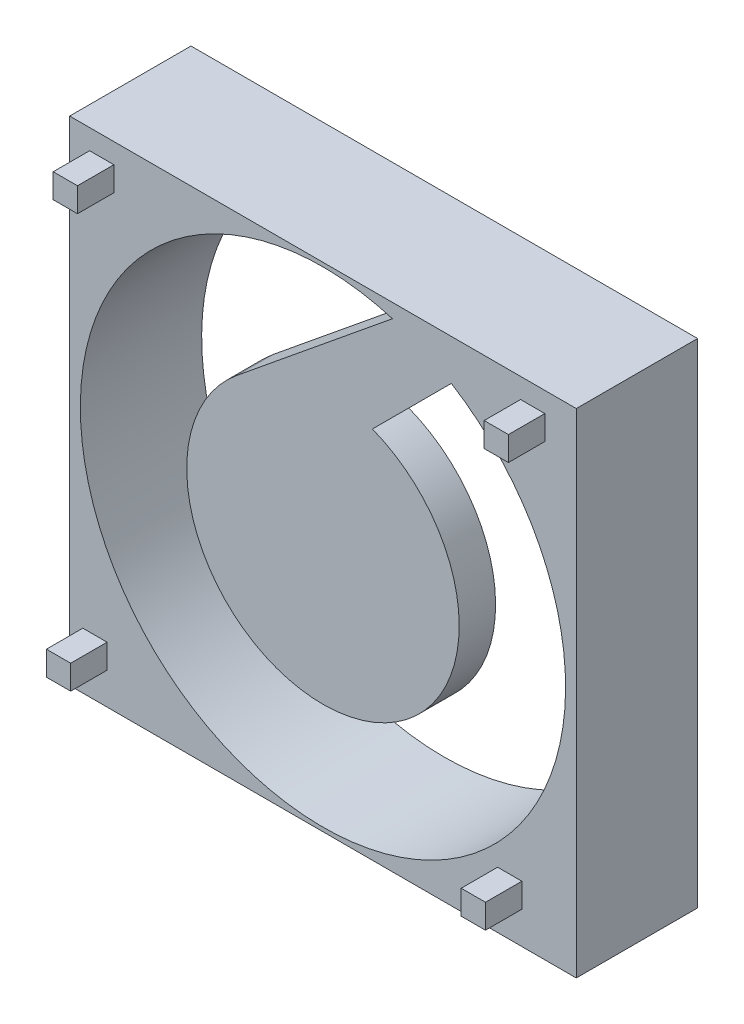
ISO-10303-21;
HEADER;
FILE_DESCRIPTION(('STEP AP214'),'2;1');
FILE_NAME('part.step','',(''),(''),'','','');
FILE_SCHEMA(('AUTOMOTIVE_DESIGN { 1 0 10303 214 1 1 1 1 }'));
ENDSEC;
DATA;
#1=APPLICATION_CONTEXT('core data for automotive mechanical design processes');
#2=APPLICATION_PROTOCOL_DEFINITION('international standard','automotive_design',2000,#1);
#3=PRODUCT_CONTEXT('',#1,'mechanical');
#4=PRODUCT('Part','Part','',(#3));
#5=PRODUCT_RELATED_PRODUCT_CATEGORY('part','',(#4));
#6=PRODUCT_DEFINITION_FORMATION('','',#4);
#7=PRODUCT_DEFINITION_CONTEXT('part definition',#1,'design');
#8=PRODUCT_DEFINITION('design','',#6,#7);
#9=PRODUCT_DEFINITION_SHAPE('','',#8);
#10=(LENGTH_UNIT() NAMED_UNIT(*) SI_UNIT(.MILLI.,.METRE.));
#11=(NAMED_UNIT(*) PLANE_ANGLE_UNIT() SI_UNIT($,.RADIAN.));
#12=(NAMED_UNIT(*) SI_UNIT($,.STERADIAN.) SOLID_ANGLE_UNIT());
#13=UNCERTAINTY_MEASURE_WITH_UNIT(LENGTH_MEASURE(1.E-05),#10,'distance_accuracy_value','');
#14=(GEOMETRIC_REPRESENTATION_CONTEXT(3) GLOBAL_UNCERTAINTY_ASSIGNED_CONTEXT((#13)) GLOBAL_UNIT_ASSIGNED_CONTEXT((#10,
#11,#12)) REPRESENTATION_CONTEXT('',''));
#15=CARTESIAN_POINT('',(0.,0.,0.));
#16=DIRECTION('',(0.,0.,1.));
#17=DIRECTION('',(1.,0.,0.));
#18=AXIS2_PLACEMENT_3D('',#15,#16,#17);
#19=CARTESIAN_POINT('',(0.,0.,10.));
#20=DIRECTION('',(0.,0.,-1.));
#21=DIRECTION('',(-1.,0.,0.));
#22=AXIS2_PLACEMENT_3D('',#19,#20,#21);
#23=PLANE('',#22);
#24=DIRECTION('',(-1.,0.,0.));
#25=VECTOR('',#24,1.);
#26=CARTESIAN_POINT('',(0.,18.6727603891518,10.));
#27=LINE('',#26,#25);
#28=CARTESIAN_POINT('',(18.287307426408,18.6727603891518,10.));
#29=VERTEX_POINT('',#28);
#30=CARTESIAN_POINT('',(16.287307426408,18.6727603891518,10.));
#31=VERTEX_POINT('',#30);
#32=EDGE_CURVE('E315',#29,#31,#27,.T.);
#33=ORIENTED_EDGE('',*,*,#32,.F.);
#34=DIRECTION('',(0.,-1.,0.));
#35=VECTOR('',#34,1.);
#36=CARTESIAN_POINT('',(18.287307426408,0.,10.));
#37=LINE('',#36,#35);
#38=CARTESIAN_POINT('',(18.287307426408,16.6727603891518,10.));
#39=VERTEX_POINT('',#38);
#40=EDGE_CURVE('E302',#29,#39,#37,.T.);
#41=ORIENTED_EDGE('',*,*,#40,.T.);
#42=DIRECTION('',(-1.,0.,0.));
#43=VECTOR('',#42,1.);
#44=CARTESIAN_POINT('',(0.,16.6727603891518,10.));
#45=LINE('',#44,#43);
#46=CARTESIAN_POINT('',(16.287307426408,16.6727603891518,10.));
#47=VERTEX_POINT('',#46);
#48=EDGE_CURVE('E306',#39,#47,#45,.T.);
#49=ORIENTED_EDGE('',*,*,#48,.T.);
#50=DIRECTION('',(0.,-1.,0.));
#51=VECTOR('',#50,1.);
#52=CARTESIAN_POINT('',(16.287307426408,0.,10.));
#53=LINE('',#52,#51);
#54=EDGE_CURVE('E311',#31,#47,#53,.T.);
#55=ORIENTED_EDGE('',*,*,#54,.F.);
#56=EDGE_LOOP('',(#33,#41,#49,#55));
#57=FACE_BOUND('',#56,.T.);
#58=CARTESIAN_POINT('',(0.,0.,10.));
#59=DIRECTION('',(0.,0.,1.));
#60=DIRECTION('',(1.,0.,0.));
#61=AXIS2_PLACEMENT_3D('',#58,#59,#60);
#62=CIRCLE('',#61,20.);
#63=CARTESIAN_POINT('',(5.72982948591692,19.1616558277806,10.));
#64=VERTEX_POINT('',#63);
#65=CARTESIAN_POINT('',(10.5825049723093,16.9708747126084,10.));
#66=VERTEX_POINT('',#65);
#67=EDGE_CURVE('E418',#64,#66,#62,.T.);
#68=ORIENTED_EDGE('',*,*,#67,.F.);
#69=DIRECTION('',(-0.775008591387662,-0.63195069687066,0.));
#70=VECTOR('',#69,1.);
#71=CARTESIAN_POINT('',(-7.09647654565236,8.70294204705537,10.));
#72=LINE('',#71,#70);
#73=CARTESIAN_POINT('',(-7.09647654565236,8.70294204705537,10.));
#74=VERTEX_POINT('',#73);
#75=EDGE_CURVE('E376',#64,#74,#72,.T.);
#76=ORIENTED_EDGE('',*,*,#75,.T.);
#77=CARTESIAN_POINT('',(0.,0.,10.));
#78=DIRECTION('',(0.,0.,1.));
#79=DIRECTION('',(1.,0.,0.));
#80=AXIS2_PLACEMENT_3D('',#77,#78,#79);
#81=CIRCLE('',#80,11.2294781551681);
#82=CARTESIAN_POINT('',(4.0754624964018,10.4638322367009,10.));
#83=VERTEX_POINT('',#82);
#84=EDGE_CURVE('E397',#74,#83,#81,.T.);
#85=ORIENTED_EDGE('',*,*,#84,.T.);
#86=DIRECTION('',(0.707106781186546,0.707106781186549,0.));
#87=VECTOR('',#86,1.);
#88=CARTESIAN_POINT('',(4.0754624964018,10.4638322367009,10.));
#89=LINE('',#88,#87);
#90=EDGE_CURVE('E381',#83,#66,#89,.T.);
#91=ORIENTED_EDGE('',*,*,#90,.T.);
#92=EDGE_LOOP('',(#68,#76,#85,#91));
#93=FACE_BOUND('',#92,.T.);
#94=DIRECTION('',(0.,1.,0.));
#95=VECTOR('',#94,1.);
#96=CARTESIAN_POINT('',(20.8800063632261,-20.3263698308678,10.));
#97=LINE('',#96,#95);
#98=CARTESIAN_POINT('',(20.8800063632261,-20.3263698308678,10.));
#99=VERTEX_POINT('',#98);
#100=CARTESIAN_POINT('',(20.8800063632261,20.3263698308678,10.));
#101=VERTEX_POINT('',#100);
#102=EDGE_CURVE('E425',#99,#101,#97,.T.);
#103=ORIENTED_EDGE('',*,*,#102,.T.);
#104=DIRECTION('',(-1.,0.,0.));
#105=VECTOR('',#104,1.);
#106=CARTESIAN_POINT('',(-20.8800063632261,20.3263698308678,10.));
#107=LINE('',#106,#105);
#108=CARTESIAN_POINT('',(-20.8800063632261,20.3263698308678,10.));
#109=VERTEX_POINT('',#108);
#110=EDGE_CURVE('E429',#101,#109,#107,.T.);
#111=ORIENTED_EDGE('',*,*,#110,.T.);
#112=DIRECTION('',(0.,-1.,0.));
#113=VECTOR('',#112,1.);
#114=CARTESIAN_POINT('',(-20.8800063632261,-20.3263698308678,10.));
#115=LINE('',#114,#113);
#116=CARTESIAN_POINT('',(-20.8800063632261,-20.3263698308678,10.));
#117=VERTEX_POINT('',#116);
#118=EDGE_CURVE('E433',#109,#117,#115,.T.);
#119=ORIENTED_EDGE('',*,*,#118,.T.);
#120=DIRECTION('',(1.,0.,0.));
#121=VECTOR('',#120,1.);
#122=CARTESIAN_POINT('',(-20.8800063632261,-20.3263698308678,10.));
#123=LINE('',#122,#121);
#124=EDGE_CURVE('E436',#117,#99,#123,.T.);
#125=ORIENTED_EDGE('',*,*,#124,.T.);
#126=EDGE_LOOP('',(#103,#111,#119,#125));
#127=FACE_BOUND('',#126,.T.);
#128=DIRECTION('',(-1.,0.,0.));
#129=VECTOR('',#128,1.);
#130=CARTESIAN_POINT('',(0.,-15.6597907370151,10.));
#131=LINE('',#130,#129);
#132=CARTESIAN_POINT('',(16.3955137929253,-15.6597907370151,10.));
#133=VERTEX_POINT('',#132);
#134=CARTESIAN_POINT('',(14.3955137929253,-15.6597907370151,10.));
#135=VERTEX_POINT('',#134);
#136=EDGE_CURVE('E319',#133,#135,#131,.T.);
#137=ORIENTED_EDGE('',*,*,#136,.F.);
#138=DIRECTION('',(0.,-1.,0.));
#139=VECTOR('',#138,1.);
#140=CARTESIAN_POINT('',(16.3955137929253,0.,10.));
#141=LINE('',#140,#139);
#142=CARTESIAN_POINT('',(16.3955137929253,-17.6597907370151,10.));
#143=VERTEX_POINT('',#142);
#144=EDGE_CURVE('E338',#133,#143,#141,.T.);
#145=ORIENTED_EDGE('',*,*,#144,.T.);
#146=DIRECTION('',(-1.,0.,0.));
#147=VECTOR('',#146,1.);
#148=CARTESIAN_POINT('',(0.,-17.6597907370151,10.));
#149=LINE('',#148,#147);
#150=CARTESIAN_POINT('',(14.3955137929253,-17.6597907370151,10.));
#151=VERTEX_POINT('',#150);
#152=EDGE_CURVE('E357',#143,#151,#149,.T.);
#153=ORIENTED_EDGE('',*,*,#152,.T.);
#154=DIRECTION('',(0.,-1.,0.));
#155=VECTOR('',#154,1.);
#156=CARTESIAN_POINT('',(14.3955137929253,0.,10.));
#157=LINE('',#156,#155);
#158=EDGE_CURVE('E353',#135,#151,#157,.T.);
#159=ORIENTED_EDGE('',*,*,#158,.F.);
#160=EDGE_LOOP('',(#137,#145,#153,#159));
#161=FACE_BOUND('',#160,.T.);
#162=DIRECTION('',(0.,-1.,0.));
#163=VECTOR('',#162,1.);
#164=CARTESIAN_POINT('',(-17.7969044715022,-15.6917172322373,10.));
#165=LINE('',#164,#163);
#166=CARTESIAN_POINT('',(-17.7969044715022,-15.6917172322373,10.));
#167=VERTEX_POINT('',#166);
#168=CARTESIAN_POINT('',(-17.7969044715022,-17.6917172322373,10.));
#169=VERTEX_POINT('',#168);
#170=EDGE_CURVE('E67',#167,#169,#165,.T.);
#171=ORIENTED_EDGE('',*,*,#170,.T.);
#172=DIRECTION('',(-1.,0.,0.));
#173=VECTOR('',#172,1.);
#174=CARTESIAN_POINT('',(-17.7969044715022,-17.6917172322373,10.));
#175=LINE('',#174,#173);
#176=CARTESIAN_POINT('',(-19.7969044715022,-17.6917172322373,10.));
#177=VERTEX_POINT('',#176);
#178=EDGE_CURVE('E273',#169,#177,#175,.T.);
#179=ORIENTED_EDGE('',*,*,#178,.T.);
#180=DIRECTION('',(0.,-1.,0.));
#181=VECTOR('',#180,1.);
#182=CARTESIAN_POINT('',(-19.7969044715022,-15.6917172322373,10.));
#183=LINE('',#182,#181);
#184=CARTESIAN_POINT('',(-19.7969044715022,-15.6917172322373,10.));
#185=VERTEX_POINT('',#184);
#186=EDGE_CURVE('E269',#185,#177,#183,.T.);
#187=ORIENTED_EDGE('',*,*,#186,.F.);
#188=DIRECTION('',(-1.,0.,0.));
#189=VECTOR('',#188,1.);
#190=CARTESIAN_POINT('',(-17.7969044715022,-15.6917172322373,10.));
#191=LINE('',#190,#189);
#192=EDGE_CURVE('E264',#167,#185,#191,.T.);
#193=ORIENTED_EDGE('',*,*,#192,.F.);
#194=EDGE_LOOP('',(#171,#179,#187,#193));
#195=FACE_BOUND('',#194,.T.);
#196=DIRECTION('',(-1.,0.,0.));
#197=VECTOR('',#196,1.);
#198=CARTESIAN_POINT('',(-17.2363730245444,18.6727603891518,10.));
#199=LINE('',#198,#197);
#200=CARTESIAN_POINT('',(-17.2363730245444,18.6727603891518,10.));
#201=VERTEX_POINT('',#200);
#202=CARTESIAN_POINT('',(-19.2363730245444,18.6727603891518,10.));
#203=VERTEX_POINT('',#202);
#204=EDGE_CURVE('E210',#201,#203,#199,.T.);
#205=ORIENTED_EDGE('',*,*,#204,.F.);
#206=DIRECTION('',(0.,-1.,0.));
#207=VECTOR('',#206,1.);
#208=CARTESIAN_POINT('',(-17.2363730245444,18.6727603891518,10.));
#209=LINE('',#208,#207);
#210=CARTESIAN_POINT('',(-17.2363730245444,16.6727603891518,10.));
#211=VERTEX_POINT('',#210);
#212=EDGE_CURVE('E222',#201,#211,#209,.T.);
#213=ORIENTED_EDGE('',*,*,#212,.T.);
#214=DIRECTION('',(-1.,0.,0.));
#215=VECTOR('',#214,1.);
#216=CARTESIAN_POINT('',(-17.2363730245444,16.6727603891518,10.));
#217=LINE('',#216,#215);
#218=CARTESIAN_POINT('',(-19.2363730245444,16.6727603891518,10.));
#219=VERTEX_POINT('',#218);
#220=EDGE_CURVE('E59',#211,#219,#217,.T.);
#221=ORIENTED_EDGE('',*,*,#220,.T.);
#222=DIRECTION('',(0.,-1.,0.));
#223=VECTOR('',#222,1.);
#224=CARTESIAN_POINT('',(-19.2363730245444,18.6727603891518,10.));
#225=LINE('',#224,#223);
#226=EDGE_CURVE('E228',#203,#219,#225,.T.);
#227=ORIENTED_EDGE('',*,*,#226,.F.);
#228=EDGE_LOOP('',(#205,#213,#221,#227));
#229=FACE_BOUND('',#228,.T.);
#230=ADVANCED_FACE('F43',(#57,#93,#127,#161,#195,#229),#23,.F.);
#231=CARTESIAN_POINT('',(0.,0.,0.));
#232=DIRECTION('',(0.,0.,-1.));
#233=DIRECTION('',(-1.,0.,0.));
#234=AXIS2_PLACEMENT_3D('',#231,#232,#233);
#235=PLANE('',#234);
#236=DIRECTION('',(0.,1.,0.));
#237=VECTOR('',#236,1.);
#238=CARTESIAN_POINT('',(20.8800063632261,-20.3263698308678,0.));
#239=LINE('',#238,#237);
#240=CARTESIAN_POINT('',(20.8800063632261,-20.3263698308678,0.));
#241=VERTEX_POINT('',#240);
#242=CARTESIAN_POINT('',(20.8800063632261,20.3263698308678,0.));
#243=VERTEX_POINT('',#242);
#244=EDGE_CURVE('E421',#241,#243,#239,.T.);
#245=ORIENTED_EDGE('',*,*,#244,.F.);
#246=DIRECTION('',(1.,0.,0.));
#247=VECTOR('',#246,1.);
#248=CARTESIAN_POINT('',(-20.8800063632261,-20.3263698308678,0.));
#249=LINE('',#248,#247);
#250=CARTESIAN_POINT('',(-20.8800063632261,-20.3263698308678,0.));
#251=VERTEX_POINT('',#250);
#252=EDGE_CURVE('E430',#251,#241,#249,.T.);
#253=ORIENTED_EDGE('',*,*,#252,.F.);
#254=DIRECTION('',(0.,-1.,0.));
#255=VECTOR('',#254,1.);
#256=CARTESIAN_POINT('',(-20.8800063632261,-20.3263698308678,0.));
#257=LINE('',#256,#255);
#258=CARTESIAN_POINT('',(-20.8800063632261,20.3263698308678,0.));
#259=VERTEX_POINT('',#258);
#260=EDGE_CURVE('E446',#259,#251,#257,.T.);
#261=ORIENTED_EDGE('',*,*,#260,.F.);
#262=DIRECTION('',(-1.,0.,0.));
#263=VECTOR('',#262,1.);
#264=CARTESIAN_POINT('',(-20.8800063632261,20.3263698308678,0.));
#265=LINE('',#264,#263);
#266=EDGE_CURVE('E443',#243,#259,#265,.T.);
#267=ORIENTED_EDGE('',*,*,#266,.F.);
#268=EDGE_LOOP('',(#245,#253,#261,#267));
#269=FACE_BOUND('',#268,.T.);
#270=CARTESIAN_POINT('',(0.,0.,0.));
#271=DIRECTION('',(0.,0.,1.));
#272=DIRECTION('',(1.,0.,0.));
#273=AXIS2_PLACEMENT_3D('',#270,#271,#272);
#274=CIRCLE('',#273,20.);
#275=CARTESIAN_POINT('',(20.,0.,0.));
#276=VERTEX_POINT('',#275);
#277=EDGE_CURVE('E408',#276,#276,#274,.T.);
#278=ORIENTED_EDGE('',*,*,#277,.T.);
#279=EDGE_LOOP('',(#278));
#280=FACE_BOUND('',#279,.T.);
#281=ADVANCED_FACE('F469',(#269,#280),#235,.T.);
#282=CARTESIAN_POINT('',(20.8800063632261,-20.3263698308678,10.));
#283=DIRECTION('',(-1.,0.,0.));
#284=DIRECTION('',(0.,0.,1.));
#285=AXIS2_PLACEMENT_3D('',#282,#283,#284);
#286=PLANE('',#285);
#287=ORIENTED_EDGE('',*,*,#244,.T.);
#288=DIRECTION('',(0.,0.,-1.));
#289=VECTOR('',#288,1.);
#290=CARTESIAN_POINT('',(20.8800063632261,20.3263698308678,10.));
#291=LINE('',#290,#289);
#292=EDGE_CURVE('E11',#101,#243,#291,.T.);
#293=ORIENTED_EDGE('',*,*,#292,.F.);
#294=ORIENTED_EDGE('',*,*,#102,.F.);
#295=DIRECTION('',(0.,0.,-1.));
#296=VECTOR('',#295,1.);
#297=CARTESIAN_POINT('',(20.8800063632261,-20.3263698308678,10.));
#298=LINE('',#297,#296);
#299=EDGE_CURVE('E439',#99,#241,#298,.T.);
#300=ORIENTED_EDGE('',*,*,#299,.T.);
#301=EDGE_LOOP('',(#287,#293,#294,#300));
#302=FACE_BOUND('',#301,.T.);
#303=ADVANCED_FACE('F45',(#302),#286,.F.);
#304=CARTESIAN_POINT('',(-20.8800063632261,20.3263698308678,10.));
#305=DIRECTION('',(0.,-1.,0.));
#306=DIRECTION('',(0.,0.,-1.));
#307=AXIS2_PLACEMENT_3D('',#304,#305,#306);
#308=PLANE('',#307);
#309=ORIENTED_EDGE('',*,*,#266,.T.);
#310=DIRECTION('',(0.,0.,-1.));
#311=VECTOR('',#310,1.);
#312=CARTESIAN_POINT('',(-20.8800063632261,20.3263698308678,10.));
#313=LINE('',#312,#311);
#314=EDGE_CURVE('E52',#109,#259,#313,.T.);
#315=ORIENTED_EDGE('',*,*,#314,.F.);
#316=ORIENTED_EDGE('',*,*,#110,.F.);
#317=ORIENTED_EDGE('',*,*,#292,.T.);
#318=EDGE_LOOP('',(#309,#315,#316,#317));
#319=FACE_BOUND('',#318,.T.);
#320=ADVANCED_FACE('F480',(#319),#308,.F.);
#321=CARTESIAN_POINT('',(-20.8800063632261,-20.3263698308678,10.));
#322=DIRECTION('',(1.,0.,0.));
#323=DIRECTION('',(0.,0.,-1.));
#324=AXIS2_PLACEMENT_3D('',#321,#322,#323);
#325=PLANE('',#324);
#326=ORIENTED_EDGE('',*,*,#260,.T.);
#327=DIRECTION('',(0.,0.,-1.));
#328=VECTOR('',#327,1.);
#329=CARTESIAN_POINT('',(-20.8800063632261,-20.3263698308678,10.));
#330=LINE('',#329,#328);
#331=EDGE_CURVE('E454',#117,#251,#330,.T.);
#332=ORIENTED_EDGE('',*,*,#331,.F.);
#333=ORIENTED_EDGE('',*,*,#118,.F.);
#334=ORIENTED_EDGE('',*,*,#314,.T.);
#335=EDGE_LOOP('',(#326,#332,#333,#334));
#336=FACE_BOUND('',#335,.T.);
#337=ADVANCED_FACE('F463',(#336),#325,.F.);
#338=CARTESIAN_POINT('',(-20.8800063632261,-20.3263698308678,10.));
#339=DIRECTION('',(0.,1.,0.));
#340=DIRECTION('',(0.,0.,1.));
#341=AXIS2_PLACEMENT_3D('',#338,#339,#340);
#342=PLANE('',#341);
#343=ORIENTED_EDGE('',*,*,#252,.T.);
#344=ORIENTED_EDGE('',*,*,#299,.F.);
#345=ORIENTED_EDGE('',*,*,#124,.F.);
#346=ORIENTED_EDGE('',*,*,#331,.T.);
#347=EDGE_LOOP('',(#343,#344,#345,#346));
#348=FACE_BOUND('',#347,.T.);
#349=ADVANCED_FACE('F473',(#348),#342,.F.);
#350=CARTESIAN_POINT('',(0.,0.,10.));
#351=DIRECTION('',(0.,0.,-1.));
#352=DIRECTION('',(-1.,0.,0.));
#353=AXIS2_PLACEMENT_3D('',#350,#351,#352);
#354=CYLINDRICAL_SURFACE('',#353,20.);
#355=DIRECTION('',(0.,0.,1.));
#356=VECTOR('',#355,1.);
#357=CARTESIAN_POINT('',(10.5825049723093,16.9708747126084,7.));
#358=LINE('',#357,#356);
#359=CARTESIAN_POINT('',(10.5825049723093,16.9708747126084,7.));
#360=VERTEX_POINT('',#359);
#361=EDGE_CURVE('E404',#360,#66,#358,.T.);
#362=ORIENTED_EDGE('',*,*,#361,.F.);
#363=CARTESIAN_POINT('',(0.,0.,7.));
#364=DIRECTION('',(0.,0.,1.));
#365=DIRECTION('',(1.,0.,0.));
#366=AXIS2_PLACEMENT_3D('',#363,#364,#365);
#367=CIRCLE('',#366,20.);
#368=CARTESIAN_POINT('',(5.72982948591692,19.1616558277806,7.));
#369=VERTEX_POINT('',#368);
#370=EDGE_CURVE('E377',#360,#369,#367,.T.);
#371=ORIENTED_EDGE('',*,*,#370,.T.);
#372=DIRECTION('',(0.,0.,1.));
#373=VECTOR('',#372,1.);
#374=CARTESIAN_POINT('',(5.72982948591692,19.1616558277806,7.));
#375=LINE('',#374,#373);
#376=EDGE_CURVE('E393',#369,#64,#375,.T.);
#377=ORIENTED_EDGE('',*,*,#376,.T.);
#378=ORIENTED_EDGE('',*,*,#67,.T.);
#379=EDGE_LOOP('',(#362,#371,#377,#378));
#380=FACE_BOUND('',#379,.T.);
#381=ORIENTED_EDGE('',*,*,#277,.F.);
#382=EDGE_LOOP('',(#381));
#383=FACE_BOUND('',#382,.T.);
#384=ADVANCED_FACE('F497',(#380,#383),#354,.F.);
#385=CARTESIAN_POINT('',(4.0754624964018,10.4638322367009,7.));
#386=DIRECTION('',(0.707106781186549,-0.707106781186546,0.));
#387=DIRECTION('',(0.707106781186546,0.707106781186549,0.));
#388=AXIS2_PLACEMENT_3D('',#385,#386,#387);
#389=PLANE('',#388);
#390=ORIENTED_EDGE('',*,*,#90,.F.);
#391=DIRECTION('',(0.,0.,1.));
#392=VECTOR('',#391,1.);
#393=CARTESIAN_POINT('',(4.0754624964018,10.4638322367009,7.));
#394=LINE('',#393,#392);
#395=CARTESIAN_POINT('',(4.0754624964018,10.4638322367009,7.));
#396=VERTEX_POINT('',#395);
#397=EDGE_CURVE('E409',#396,#83,#394,.T.);
#398=ORIENTED_EDGE('',*,*,#397,.F.);
#399=DIRECTION('',(0.707106781186546,0.707106781186549,0.));
#400=VECTOR('',#399,1.);
#401=CARTESIAN_POINT('',(4.0754624964018,10.4638322367009,7.));
#402=LINE('',#401,#400);
#403=EDGE_CURVE('E389',#396,#360,#402,.T.);
#404=ORIENTED_EDGE('',*,*,#403,.T.);
#405=ORIENTED_EDGE('',*,*,#361,.T.);
#406=EDGE_LOOP('',(#390,#398,#404,#405));
#407=FACE_BOUND('',#406,.T.);
#408=ADVANCED_FACE('F504',(#407),#389,.T.);
#409=CARTESIAN_POINT('',(0.,0.,7.));
#410=DIRECTION('',(0.,0.,1.));
#411=DIRECTION('',(1.,0.,0.));
#412=AXIS2_PLACEMENT_3D('',#409,#410,#411);
#413=CYLINDRICAL_SURFACE('',#412,11.2294781551681);
#414=ORIENTED_EDGE('',*,*,#84,.F.);
#415=DIRECTION('',(0.,0.,1.));
#416=VECTOR('',#415,1.);
#417=CARTESIAN_POINT('',(-7.09647654565236,8.70294204705537,7.));
#418=LINE('',#417,#416);
#419=CARTESIAN_POINT('',(-7.09647654565236,8.70294204705537,7.));
#420=VERTEX_POINT('',#419);
#421=EDGE_CURVE('E412',#420,#74,#418,.T.);
#422=ORIENTED_EDGE('',*,*,#421,.F.);
#423=CARTESIAN_POINT('',(0.,0.,7.));
#424=DIRECTION('',(0.,0.,1.));
#425=DIRECTION('',(1.,0.,0.));
#426=AXIS2_PLACEMENT_3D('',#423,#424,#425);
#427=CIRCLE('',#426,11.2294781551681);
#428=EDGE_CURVE('E385',#420,#396,#427,.T.);
#429=ORIENTED_EDGE('',*,*,#428,.T.);
#430=ORIENTED_EDGE('',*,*,#397,.T.);
#431=EDGE_LOOP('',(#414,#422,#429,#430));
#432=FACE_BOUND('',#431,.T.);
#433=ADVANCED_FACE('F509',(#432),#413,.T.);
#434=CARTESIAN_POINT('',(-7.09647654565236,8.70294204705537,7.));
#435=DIRECTION('',(-0.63195069687066,0.775008591387662,0.));
#436=DIRECTION('',(-0.775008591387662,-0.63195069687066,0.));
#437=AXIS2_PLACEMENT_3D('',#434,#435,#436);
#438=PLANE('',#437);
#439=ORIENTED_EDGE('',*,*,#75,.F.);
#440=ORIENTED_EDGE('',*,*,#376,.F.);
#441=DIRECTION('',(-0.775008591387662,-0.63195069687066,0.));
#442=VECTOR('',#441,1.);
#443=CARTESIAN_POINT('',(-7.09647654565236,8.70294204705537,7.));
#444=LINE('',#443,#442);
#445=EDGE_CURVE('E380',#369,#420,#444,.T.);
#446=ORIENTED_EDGE('',*,*,#445,.T.);
#447=ORIENTED_EDGE('',*,*,#421,.T.);
#448=EDGE_LOOP('',(#439,#440,#446,#447));
#449=FACE_BOUND('',#448,.T.);
#450=ADVANCED_FACE('F526',(#449),#438,.T.);
#451=CARTESIAN_POINT('',(0.,0.,7.));
#452=DIRECTION('',(0.,0.,1.));
#453=DIRECTION('',(1.,0.,0.));
#454=AXIS2_PLACEMENT_3D('',#451,#452,#453);
#455=PLANE('',#454);
#456=ORIENTED_EDGE('',*,*,#370,.F.);
#457=ORIENTED_EDGE('',*,*,#403,.F.);
#458=ORIENTED_EDGE('',*,*,#428,.F.);
#459=ORIENTED_EDGE('',*,*,#445,.F.);
#460=EDGE_LOOP('',(#456,#457,#458,#459));
#461=FACE_BOUND('',#460,.T.);
#462=ADVANCED_FACE('F520',(#461),#455,.F.);
#463=CARTESIAN_POINT('',(0.,-15.6597907370151,13.));
#464=DIRECTION('',(0.,-1.,0.));
#465=DIRECTION('',(0.,0.,-1.));
#466=AXIS2_PLACEMENT_3D('',#463,#464,#465);
#467=PLANE('',#466);
#468=ORIENTED_EDGE('',*,*,#136,.T.);
#469=DIRECTION('',(0.,0.,-1.));
#470=VECTOR('',#469,1.);
#471=CARTESIAN_POINT('',(14.3955137929253,-15.6597907370151,13.));
#472=LINE('',#471,#470);
#473=CARTESIAN_POINT('',(14.3955137929253,-15.6597907370151,13.));
#474=VERTEX_POINT('',#473);
#475=EDGE_CURVE('E373',#474,#135,#472,.T.);
#476=ORIENTED_EDGE('',*,*,#475,.F.);
#477=DIRECTION('',(-1.,0.,0.));
#478=VECTOR('',#477,1.);
#479=CARTESIAN_POINT('',(0.,-15.6597907370151,13.));
#480=LINE('',#479,#478);
#481=CARTESIAN_POINT('',(16.3955137929253,-15.6597907370151,13.));
#482=VERTEX_POINT('',#481);
#483=EDGE_CURVE('E333',#482,#474,#480,.T.);
#484=ORIENTED_EDGE('',*,*,#483,.F.);
#485=DIRECTION('',(0.,0.,-1.));
#486=VECTOR('',#485,1.);
#487=CARTESIAN_POINT('',(16.3955137929253,-15.6597907370151,13.));
#488=LINE('',#487,#486);
#489=EDGE_CURVE('E349',#482,#133,#488,.T.);
#490=ORIENTED_EDGE('',*,*,#489,.T.);
#491=EDGE_LOOP('',(#468,#476,#484,#490));
#492=FACE_BOUND('',#491,.T.);
#493=ADVANCED_FACE('F532',(#492),#467,.F.);
#494=CARTESIAN_POINT('',(14.3955137929253,0.,13.));
#495=DIRECTION('',(1.,0.,0.));
#496=DIRECTION('',(0.,1.,0.));
#497=AXIS2_PLACEMENT_3D('',#494,#495,#496);
#498=PLANE('',#497);
#499=ORIENTED_EDGE('',*,*,#158,.T.);
#500=DIRECTION('',(0.,0.,-1.));
#501=VECTOR('',#500,1.);
#502=CARTESIAN_POINT('',(14.3955137929253,-17.6597907370151,13.));
#503=LINE('',#502,#501);
#504=CARTESIAN_POINT('',(14.3955137929253,-17.6597907370151,13.));
#505=VERTEX_POINT('',#504);
#506=EDGE_CURVE('E370',#505,#151,#503,.T.);
#507=ORIENTED_EDGE('',*,*,#506,.F.);
#508=DIRECTION('',(0.,-1.,0.));
#509=VECTOR('',#508,1.);
#510=CARTESIAN_POINT('',(14.3955137929253,0.,13.));
#511=LINE('',#510,#509);
#512=EDGE_CURVE('E337',#474,#505,#511,.T.);
#513=ORIENTED_EDGE('',*,*,#512,.F.);
#514=ORIENTED_EDGE('',*,*,#475,.T.);
#515=EDGE_LOOP('',(#499,#507,#513,#514));
#516=FACE_BOUND('',#515,.T.);
#517=ADVANCED_FACE('F538',(#516),#498,.F.);
#518=CARTESIAN_POINT('',(0.,-17.6597907370151,13.));
#519=DIRECTION('',(0.,-1.,0.));
#520=DIRECTION('',(0.,0.,-1.));
#521=AXIS2_PLACEMENT_3D('',#518,#519,#520);
#522=PLANE('',#521);
#523=ORIENTED_EDGE('',*,*,#152,.F.);
#524=DIRECTION('',(0.,0.,-1.));
#525=VECTOR('',#524,1.);
#526=CARTESIAN_POINT('',(16.3955137929253,-17.6597907370151,13.));
#527=LINE('',#526,#525);
#528=CARTESIAN_POINT('',(16.3955137929253,-17.6597907370151,13.));
#529=VERTEX_POINT('',#528);
#530=EDGE_CURVE('E366',#529,#143,#527,.T.);
#531=ORIENTED_EDGE('',*,*,#530,.F.);
#532=DIRECTION('',(-1.,0.,0.));
#533=VECTOR('',#532,1.);
#534=CARTESIAN_POINT('',(0.,-17.6597907370151,13.));
#535=LINE('',#534,#533);
#536=EDGE_CURVE('E341',#529,#505,#535,.T.);
#537=ORIENTED_EDGE('',*,*,#536,.T.);
#538=ORIENTED_EDGE('',*,*,#506,.T.);
#539=EDGE_LOOP('',(#523,#531,#537,#538));
#540=FACE_BOUND('',#539,.T.);
#541=ADVANCED_FACE('F542',(#540),#522,.T.);
#542=CARTESIAN_POINT('',(16.3955137929253,0.,13.));
#543=DIRECTION('',(1.,0.,0.));
#544=DIRECTION('',(0.,0.,-1.));
#545=AXIS2_PLACEMENT_3D('',#542,#543,#544);
#546=PLANE('',#545);
#547=ORIENTED_EDGE('',*,*,#144,.F.);
#548=ORIENTED_EDGE('',*,*,#489,.F.);
#549=DIRECTION('',(0.,-1.,0.));
#550=VECTOR('',#549,1.);
#551=CARTESIAN_POINT('',(16.3955137929253,0.,13.));
#552=LINE('',#551,#550);
#553=EDGE_CURVE('E345',#482,#529,#552,.T.);
#554=ORIENTED_EDGE('',*,*,#553,.T.);
#555=ORIENTED_EDGE('',*,*,#530,.T.);
#556=EDGE_LOOP('',(#547,#548,#554,#555));
#557=FACE_BOUND('',#556,.T.);
#558=ADVANCED_FACE('F546',(#557),#546,.T.);
#559=CARTESIAN_POINT('',(0.,0.,13.));
#560=DIRECTION('',(0.,0.,1.));
#561=DIRECTION('',(1.,0.,0.));
#562=AXIS2_PLACEMENT_3D('',#559,#560,#561);
#563=PLANE('',#562);
#564=ORIENTED_EDGE('',*,*,#483,.T.);
#565=ORIENTED_EDGE('',*,*,#512,.T.);
#566=ORIENTED_EDGE('',*,*,#536,.F.);
#567=ORIENTED_EDGE('',*,*,#553,.F.);
#568=EDGE_LOOP('',(#564,#565,#566,#567));
#569=FACE_BOUND('',#568,.T.);
#570=ADVANCED_FACE('F550',(#569),#563,.T.);
#571=CARTESIAN_POINT('',(0.,18.6727603891518,13.));
#572=DIRECTION('',(0.,-1.,0.));
#573=DIRECTION('',(0.,0.,-1.));
#574=AXIS2_PLACEMENT_3D('',#571,#572,#573);
#575=PLANE('',#574);
#576=ORIENTED_EDGE('',*,*,#32,.T.);
#577=DIRECTION('',(0.,0.,-1.));
#578=VECTOR('',#577,1.);
#579=CARTESIAN_POINT('',(16.287307426408,18.6727603891518,13.));
#580=LINE('',#579,#578);
#581=CARTESIAN_POINT('',(16.287307426408,18.6727603891518,13.));
#582=VERTEX_POINT('',#581);
#583=EDGE_CURVE('E276',#582,#31,#580,.T.);
#584=ORIENTED_EDGE('',*,*,#583,.F.);
#585=DIRECTION('',(-1.,0.,0.));
#586=VECTOR('',#585,1.);
#587=CARTESIAN_POINT('',(0.,18.6727603891518,13.));
#588=LINE('',#587,#586);
#589=CARTESIAN_POINT('',(18.287307426408,18.6727603891518,13.));
#590=VERTEX_POINT('',#589);
#591=EDGE_CURVE('E307',#590,#582,#588,.T.);
#592=ORIENTED_EDGE('',*,*,#591,.F.);
#593=DIRECTION('',(0.,0.,-1.));
#594=VECTOR('',#593,1.);
#595=CARTESIAN_POINT('',(18.287307426408,18.6727603891518,13.));
#596=LINE('',#595,#594);
#597=EDGE_CURVE('E298',#590,#29,#596,.T.);
#598=ORIENTED_EDGE('',*,*,#597,.T.);
#599=EDGE_LOOP('',(#576,#584,#592,#598));
#600=FACE_BOUND('',#599,.T.);
#601=ADVANCED_FACE('F554',(#600),#575,.F.);
#602=CARTESIAN_POINT('',(16.287307426408,0.,13.));
#603=DIRECTION('',(1.,0.,0.));
#604=DIRECTION('',(0.,0.,-1.));
#605=AXIS2_PLACEMENT_3D('',#602,#603,#604);
#606=PLANE('',#605);
#607=ORIENTED_EDGE('',*,*,#54,.T.);
#608=DIRECTION('',(0.,0.,-1.));
#609=VECTOR('',#608,1.);
#610=CARTESIAN_POINT('',(16.287307426408,16.6727603891518,13.));
#611=LINE('',#610,#609);
#612=CARTESIAN_POINT('',(16.287307426408,16.6727603891518,13.));
#613=VERTEX_POINT('',#612);
#614=EDGE_CURVE('E291',#613,#47,#611,.T.);
#615=ORIENTED_EDGE('',*,*,#614,.F.);
#616=DIRECTION('',(0.,-1.,0.));
#617=VECTOR('',#616,1.);
#618=CARTESIAN_POINT('',(16.287307426408,0.,13.));
#619=LINE('',#618,#617);
#620=EDGE_CURVE('E327',#582,#613,#619,.T.);
#621=ORIENTED_EDGE('',*,*,#620,.F.);
#622=ORIENTED_EDGE('',*,*,#583,.T.);
#623=EDGE_LOOP('',(#607,#615,#621,#622));
#624=FACE_BOUND('',#623,.T.);
#625=ADVANCED_FACE('F568',(#624),#606,.F.);
#626=CARTESIAN_POINT('',(0.,16.6727603891518,13.));
#627=DIRECTION('',(0.,-1.,0.));
#628=DIRECTION('',(0.,0.,-1.));
#629=AXIS2_PLACEMENT_3D('',#626,#627,#628);
#630=PLANE('',#629);
#631=ORIENTED_EDGE('',*,*,#48,.F.);
#632=DIRECTION('',(0.,0.,-1.));
#633=VECTOR('',#632,1.);
#634=CARTESIAN_POINT('',(18.287307426408,16.6727603891518,13.));
#635=LINE('',#634,#633);
#636=CARTESIAN_POINT('',(18.287307426408,16.6727603891518,13.));
#637=VERTEX_POINT('',#636);
#638=EDGE_CURVE('E294',#637,#39,#635,.T.);
#639=ORIENTED_EDGE('',*,*,#638,.F.);
#640=DIRECTION('',(-1.,0.,0.));
#641=VECTOR('',#640,1.);
#642=CARTESIAN_POINT('',(0.,16.6727603891518,13.));
#643=LINE('',#642,#641);
#644=EDGE_CURVE('E323',#637,#613,#643,.T.);
#645=ORIENTED_EDGE('',*,*,#644,.T.);
#646=ORIENTED_EDGE('',*,*,#614,.T.);
#647=EDGE_LOOP('',(#631,#639,#645,#646));
#648=FACE_BOUND('',#647,.T.);
#649=ADVANCED_FACE('F564',(#648),#630,.T.);
#650=CARTESIAN_POINT('',(18.287307426408,0.,13.));
#651=DIRECTION('',(1.,0.,0.));
#652=DIRECTION('',(0.,0.,-1.));
#653=AXIS2_PLACEMENT_3D('',#650,#651,#652);
#654=PLANE('',#653);
#655=ORIENTED_EDGE('',*,*,#40,.F.);
#656=ORIENTED_EDGE('',*,*,#597,.F.);
#657=DIRECTION('',(0.,-1.,0.));
#658=VECTOR('',#657,1.);
#659=CARTESIAN_POINT('',(18.287307426408,0.,13.));
#660=LINE('',#659,#658);
#661=EDGE_CURVE('E301',#590,#637,#660,.T.);
#662=ORIENTED_EDGE('',*,*,#661,.T.);
#663=ORIENTED_EDGE('',*,*,#638,.T.);
#664=EDGE_LOOP('',(#655,#656,#662,#663));
#665=FACE_BOUND('',#664,.T.);
#666=ADVANCED_FACE('F560',(#665),#654,.T.);
#667=CARTESIAN_POINT('',(0.,0.,13.));
#668=DIRECTION('',(0.,0.,1.));
#669=DIRECTION('',(1.,0.,0.));
#670=AXIS2_PLACEMENT_3D('',#667,#668,#669);
#671=PLANE('',#670);
#672=ORIENTED_EDGE('',*,*,#591,.T.);
#673=ORIENTED_EDGE('',*,*,#620,.T.);
#674=ORIENTED_EDGE('',*,*,#644,.F.);
#675=ORIENTED_EDGE('',*,*,#661,.F.);
#676=EDGE_LOOP('',(#672,#673,#674,#675));
#677=FACE_BOUND('',#676,.T.);
#678=ADVANCED_FACE('F556',(#677),#671,.T.);
#679=CARTESIAN_POINT('',(-17.7969044715022,-17.6917172322373,13.));
#680=DIRECTION('',(0.,-1.,0.));
#681=DIRECTION('',(0.,0.,-1.));
#682=AXIS2_PLACEMENT_3D('',#679,#680,#681);
#683=PLANE('',#682);
#684=ORIENTED_EDGE('',*,*,#178,.F.);
#685=DIRECTION('',(0.,0.,-1.));
#686=VECTOR('',#685,1.);
#687=CARTESIAN_POINT('',(-17.7969044715022,-17.6917172322373,13.));
#688=LINE('',#687,#686);
#689=CARTESIAN_POINT('',(-17.7969044715022,-17.6917172322373,13.));
#690=VERTEX_POINT('',#689);
#691=EDGE_CURVE('E230',#690,#169,#688,.T.);
#692=ORIENTED_EDGE('',*,*,#691,.F.);
#693=DIRECTION('',(-1.,0.,0.));
#694=VECTOR('',#693,1.);
#695=CARTESIAN_POINT('',(-17.7969044715022,-17.6917172322373,13.));
#696=LINE('',#695,#694);
#697=CARTESIAN_POINT('',(-19.7969044715022,-17.6917172322373,13.));
#698=VERTEX_POINT('',#697);
#699=EDGE_CURVE('E265',#690,#698,#696,.T.);
#700=ORIENTED_EDGE('',*,*,#699,.T.);
#701=DIRECTION('',(0.,0.,-1.));
#702=VECTOR('',#701,1.);
#703=CARTESIAN_POINT('',(-19.7969044715022,-17.6917172322373,13.));
#704=LINE('',#703,#702);
#705=EDGE_CURVE('E250',#698,#177,#704,.T.);
#706=ORIENTED_EDGE('',*,*,#705,.T.);
#707=EDGE_LOOP('',(#684,#692,#700,#706));
#708=FACE_BOUND('',#707,.T.);
#709=ADVANCED_FACE('F559',(#708),#683,.T.);
#710=CARTESIAN_POINT('',(-17.7969044715022,-15.6917172322373,13.));
#711=DIRECTION('',(1.,0.,0.));
#712=DIRECTION('',(0.,0.,-1.));
#713=AXIS2_PLACEMENT_3D('',#710,#711,#712);
#714=PLANE('',#713);
#715=ORIENTED_EDGE('',*,*,#170,.F.);
#716=DIRECTION('',(0.,0.,-1.));
#717=VECTOR('',#716,1.);
#718=CARTESIAN_POINT('',(-17.7969044715022,-15.6917172322373,13.));
#719=LINE('',#718,#717);
#720=CARTESIAN_POINT('',(-17.7969044715022,-15.6917172322373,13.));
#721=VERTEX_POINT('',#720);
#722=EDGE_CURVE('E234',#721,#167,#719,.T.);
#723=ORIENTED_EDGE('',*,*,#722,.F.);
#724=DIRECTION('',(0.,-1.,0.));
#725=VECTOR('',#724,1.);
#726=CARTESIAN_POINT('',(-17.7969044715022,-15.6917172322373,13.));
#727=LINE('',#726,#725);
#728=EDGE_CURVE('E254',#721,#690,#727,.T.);
#729=ORIENTED_EDGE('',*,*,#728,.T.);
#730=ORIENTED_EDGE('',*,*,#691,.T.);
#731=EDGE_LOOP('',(#715,#723,#729,#730));
#732=FACE_BOUND('',#731,.T.);
#733=ADVANCED_FACE('F581',(#732),#714,.T.);
#734=CARTESIAN_POINT('',(-17.7969044715022,-15.6917172322373,13.));
#735=DIRECTION('',(0.,-1.,0.));
#736=DIRECTION('',(0.,0.,-1.));
#737=AXIS2_PLACEMENT_3D('',#734,#735,#736);
#738=PLANE('',#737);
#739=ORIENTED_EDGE('',*,*,#192,.T.);
#740=DIRECTION('',(0.,0.,-1.));
#741=VECTOR('',#740,1.);
#742=CARTESIAN_POINT('',(-19.7969044715022,-15.6917172322373,13.));
#743=LINE('',#742,#741);
#744=CARTESIAN_POINT('',(-19.7969044715022,-15.6917172322373,13.));
#745=VERTEX_POINT('',#744);
#746=EDGE_CURVE('E255',#745,#185,#743,.T.);
#747=ORIENTED_EDGE('',*,*,#746,.F.);
#748=DIRECTION('',(-1.,0.,0.));
#749=VECTOR('',#748,1.);
#750=CARTESIAN_POINT('',(-17.7969044715022,-15.6917172322373,13.));
#751=LINE('',#750,#749);
#752=EDGE_CURVE('E280',#721,#745,#751,.T.);
#753=ORIENTED_EDGE('',*,*,#752,.F.);
#754=ORIENTED_EDGE('',*,*,#722,.T.);
#755=EDGE_LOOP('',(#739,#747,#753,#754));
#756=FACE_BOUND('',#755,.T.);
#757=ADVANCED_FACE('F584',(#756),#738,.F.);
#758=CARTESIAN_POINT('',(-19.7969044715022,-15.6917172322373,13.));
#759=DIRECTION('',(1.,0.,0.));
#760=DIRECTION('',(0.,0.,-1.));
#761=AXIS2_PLACEMENT_3D('',#758,#759,#760);
#762=PLANE('',#761);
#763=ORIENTED_EDGE('',*,*,#186,.T.);
#764=ORIENTED_EDGE('',*,*,#705,.F.);
#765=DIRECTION('',(0.,-1.,0.));
#766=VECTOR('',#765,1.);
#767=CARTESIAN_POINT('',(-19.7969044715022,-15.6917172322373,13.));
#768=LINE('',#767,#766);
#769=EDGE_CURVE('E283',#745,#698,#768,.T.);
#770=ORIENTED_EDGE('',*,*,#769,.F.);
#771=ORIENTED_EDGE('',*,*,#746,.T.);
#772=EDGE_LOOP('',(#763,#764,#770,#771));
#773=FACE_BOUND('',#772,.T.);
#774=ADVANCED_FACE('F579',(#773),#762,.F.);
#775=CARTESIAN_POINT('',(0.,0.,13.));
#776=DIRECTION('',(0.,0.,1.));
#777=DIRECTION('',(1.,0.,0.));
#778=AXIS2_PLACEMENT_3D('',#775,#776,#777);
#779=PLANE('',#778);
#780=ORIENTED_EDGE('',*,*,#699,.F.);
#781=ORIENTED_EDGE('',*,*,#728,.F.);
#782=ORIENTED_EDGE('',*,*,#752,.T.);
#783=ORIENTED_EDGE('',*,*,#769,.T.);
#784=EDGE_LOOP('',(#780,#781,#782,#783));
#785=FACE_BOUND('',#784,.T.);
#786=ADVANCED_FACE('F576',(#785),#779,.T.);
#787=CARTESIAN_POINT('',(-17.2363730245444,18.6727603891518,13.));
#788=DIRECTION('',(0.,-1.,0.));
#789=DIRECTION('',(0.,0.,-1.));
#790=AXIS2_PLACEMENT_3D('',#787,#788,#789);
#791=PLANE('',#790);
#792=ORIENTED_EDGE('',*,*,#204,.T.);
#793=DIRECTION('',(0.,0.,-1.));
#794=VECTOR('',#793,1.);
#795=CARTESIAN_POINT('',(-19.2363730245444,18.6727603891518,13.));
#796=LINE('',#795,#794);
#797=CARTESIAN_POINT('',(-19.2363730245444,18.6727603891518,13.));
#798=VERTEX_POINT('',#797);
#799=EDGE_CURVE('E800',#798,#203,#796,.T.);
#800=ORIENTED_EDGE('',*,*,#799,.F.);
#801=DIRECTION('',(-1.,0.,0.));
#802=VECTOR('',#801,1.);
#803=CARTESIAN_POINT('',(-17.2363730245444,18.6727603891518,13.));
#804=LINE('',#803,#802);
#805=CARTESIAN_POINT('',(-17.2363730245444,18.6727603891518,13.));
#806=VERTEX_POINT('',#805);
#807=EDGE_CURVE('E213',#806,#798,#804,.T.);
#808=ORIENTED_EDGE('',*,*,#807,.F.);
#809=DIRECTION('',(0.,0.,-1.));
#810=VECTOR('',#809,1.);
#811=CARTESIAN_POINT('',(-17.2363730245444,18.6727603891518,13.));
#812=LINE('',#811,#810);
#813=EDGE_CURVE('E205',#806,#201,#812,.T.);
#814=ORIENTED_EDGE('',*,*,#813,.T.);
#815=EDGE_LOOP('',(#792,#800,#808,#814));
#816=FACE_BOUND('',#815,.T.);
#817=ADVANCED_FACE('F207',(#816),#791,.F.);
#818=CARTESIAN_POINT('',(-19.2363730245444,18.6727603891518,13.));
#819=DIRECTION('',(1.,0.,0.));
#820=DIRECTION('',(0.,0.,-1.));
#821=AXIS2_PLACEMENT_3D('',#818,#819,#820);
#822=PLANE('',#821);
#823=ORIENTED_EDGE('',*,*,#226,.T.);
#824=DIRECTION('',(0.,0.,-1.));
#825=VECTOR('',#824,1.);
#826=CARTESIAN_POINT('',(-19.2363730245444,16.6727603891518,13.));
#827=LINE('',#826,#825);
#828=CARTESIAN_POINT('',(-19.2363730245444,16.6727603891518,13.));
#829=VERTEX_POINT('',#828);
#830=EDGE_CURVE('E799',#829,#219,#827,.T.);
#831=ORIENTED_EDGE('',*,*,#830,.F.);
#832=DIRECTION('',(0.,-1.,0.));
#833=VECTOR('',#832,1.);
#834=CARTESIAN_POINT('',(-19.2363730245444,18.6727603891518,13.));
#835=LINE('',#834,#833);
#836=EDGE_CURVE('E245',#798,#829,#835,.T.);
#837=ORIENTED_EDGE('',*,*,#836,.F.);
#838=ORIENTED_EDGE('',*,*,#799,.T.);
#839=EDGE_LOOP('',(#823,#831,#837,#838));
#840=FACE_BOUND('',#839,.T.);
#841=ADVANCED_FACE('F604',(#840),#822,.F.);
#842=CARTESIAN_POINT('',(-17.2363730245444,16.6727603891518,13.));
#843=DIRECTION('',(0.,-1.,0.));
#844=DIRECTION('',(0.,0.,-1.));
#845=AXIS2_PLACEMENT_3D('',#842,#843,#844);
#846=PLANE('',#845);
#847=ORIENTED_EDGE('',*,*,#220,.F.);
#848=DIRECTION('',(0.,0.,-1.));
#849=VECTOR('',#848,1.);
#850=CARTESIAN_POINT('',(-17.2363730245444,16.6727603891518,13.));
#851=LINE('',#850,#849);
#852=CARTESIAN_POINT('',(-17.2363730245444,16.6727603891518,13.));
#853=VERTEX_POINT('',#852);
#854=EDGE_CURVE('E219',#853,#211,#851,.T.);
#855=ORIENTED_EDGE('',*,*,#854,.F.);
#856=DIRECTION('',(-1.,0.,0.));
#857=VECTOR('',#856,1.);
#858=CARTESIAN_POINT('',(-17.2363730245444,16.6727603891518,13.));
#859=LINE('',#858,#857);
#860=EDGE_CURVE('E241',#853,#829,#859,.T.);
#861=ORIENTED_EDGE('',*,*,#860,.T.);
#862=ORIENTED_EDGE('',*,*,#830,.T.);
#863=EDGE_LOOP('',(#847,#855,#861,#862));
#864=FACE_BOUND('',#863,.T.);
#865=ADVANCED_FACE('F601',(#864),#846,.T.);
#866=CARTESIAN_POINT('',(-17.2363730245444,18.6727603891518,13.));
#867=DIRECTION('',(1.,0.,0.));
#868=DIRECTION('',(0.,0.,-1.));
#869=AXIS2_PLACEMENT_3D('',#866,#867,#868);
#870=PLANE('',#869);
#871=ORIENTED_EDGE('',*,*,#212,.F.);
#872=ORIENTED_EDGE('',*,*,#813,.F.);
#873=DIRECTION('',(0.,-1.,0.));
#874=VECTOR('',#873,1.);
#875=CARTESIAN_POINT('',(-17.2363730245444,18.6727603891518,13.));
#876=LINE('',#875,#874);
#877=EDGE_CURVE('E218',#806,#853,#876,.T.);
#878=ORIENTED_EDGE('',*,*,#877,.T.);
#879=ORIENTED_EDGE('',*,*,#854,.T.);
#880=EDGE_LOOP('',(#871,#872,#878,#879));
#881=FACE_BOUND('',#880,.T.);
#882=ADVANCED_FACE('F223',(#881),#870,.T.);
#883=CARTESIAN_POINT('',(0.,0.,13.));
#884=DIRECTION('',(0.,0.,1.));
#885=DIRECTION('',(1.,0.,0.));
#886=AXIS2_PLACEMENT_3D('',#883,#884,#885);
#887=PLANE('',#886);
#888=ORIENTED_EDGE('',*,*,#807,.T.);
#889=ORIENTED_EDGE('',*,*,#836,.T.);
#890=ORIENTED_EDGE('',*,*,#860,.F.);
#891=ORIENTED_EDGE('',*,*,#877,.F.);
#892=EDGE_LOOP('',(#888,#889,#890,#891));
#893=FACE_BOUND('',#892,.T.);
#894=ADVANCED_FACE('F595',(#893),#887,.T.);
#895=CLOSED_SHELL('',(#230,#281,#303,#320,#337,#349,#384,#408,#433,#450,#462,#493,#517,#541,
#558,#570,#601,#625,#649,#666,#678,#709,#733,#757,#774,#786,#817,#841,#865,#882,#894));
#896=MANIFOLD_SOLID_BREP('B2',#895);
#897=ADVANCED_BREP_SHAPE_REPRESENTATION('',(#18,#896),#14);
#898=SHAPE_DEFINITION_REPRESENTATION(#9,#897);
ENDSEC;
END-ISO-10303-21;
